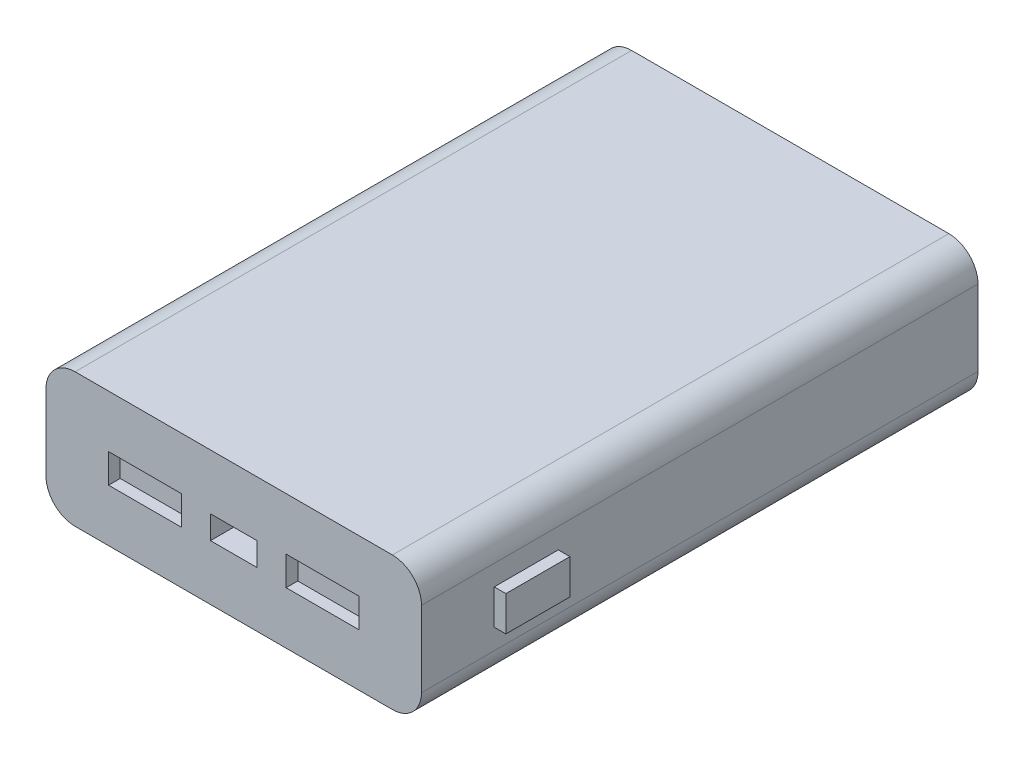
ISO-10303-21;
HEADER;
FILE_DESCRIPTION(('STEP AP214'),'2;1');
FILE_NAME('part.step','',(''),(''),'','','');
FILE_SCHEMA(('AUTOMOTIVE_DESIGN { 1 0 10303 214 1 1 1 1 }'));
ENDSEC;
DATA;
#1=APPLICATION_CONTEXT('core data for automotive mechanical design processes');
#2=APPLICATION_PROTOCOL_DEFINITION('international standard','automotive_design',2000,#1);
#3=PRODUCT_CONTEXT('',#1,'mechanical');
#4=PRODUCT('Part','Part','',(#3));
#5=PRODUCT_RELATED_PRODUCT_CATEGORY('part','',(#4));
#6=PRODUCT_DEFINITION_FORMATION('','',#4);
#7=PRODUCT_DEFINITION_CONTEXT('part definition',#1,'design');
#8=PRODUCT_DEFINITION('design','',#6,#7);
#9=PRODUCT_DEFINITION_SHAPE('','',#8);
#10=(LENGTH_UNIT() NAMED_UNIT(*) SI_UNIT(.MILLI.,.METRE.));
#11=(NAMED_UNIT(*) PLANE_ANGLE_UNIT() SI_UNIT($,.RADIAN.));
#12=(NAMED_UNIT(*) SI_UNIT($,.STERADIAN.) SOLID_ANGLE_UNIT());
#13=UNCERTAINTY_MEASURE_WITH_UNIT(LENGTH_MEASURE(1.E-05),#10,'distance_accuracy_value','');
#14=(GEOMETRIC_REPRESENTATION_CONTEXT(3) GLOBAL_UNCERTAINTY_ASSIGNED_CONTEXT((#13)) GLOBAL_UNIT_ASSIGNED_CONTEXT((#10,
#11,#12)) REPRESENTATION_CONTEXT('',''));
#15=CARTESIAN_POINT('',(0.,0.,0.));
#16=DIRECTION('',(0.,0.,1.));
#17=DIRECTION('',(1.,0.,0.));
#18=AXIS2_PLACEMENT_3D('',#15,#16,#17);
#19=CARTESIAN_POINT('',(34.25,-3.,72.1));
#20=DIRECTION('',(0.,0.,1.));
#21=DIRECTION('',(1.,0.,0.));
#22=AXIS2_PLACEMENT_3D('',#19,#20,#21);
#23=PLANE('',#22);
#24=DIRECTION('',(0.,1.,0.));
#25=VECTOR('',#24,1.);
#26=CARTESIAN_POINT('',(32.25,-3.,72.1));
#27=LINE('',#26,#25);
#28=CARTESIAN_POINT('',(32.25,-3.,72.1));
#29=VERTEX_POINT('',#28);
#30=CARTESIAN_POINT('',(32.25,3.,72.1));
#31=VERTEX_POINT('',#30);
#32=EDGE_CURVE('E105',#29,#31,#27,.T.);
#33=ORIENTED_EDGE('',*,*,#32,.T.);
#34=DIRECTION('',(-1.,0.,0.));
#35=VECTOR('',#34,1.);
#36=CARTESIAN_POINT('',(34.25,3.,72.1));
#37=LINE('',#36,#35);
#38=CARTESIAN_POINT('',(34.25,3.,72.1));
#39=VERTEX_POINT('',#38);
#40=EDGE_CURVE('E12',#39,#31,#37,.T.);
#41=ORIENTED_EDGE('',*,*,#40,.F.);
#42=DIRECTION('',(0.,1.,0.));
#43=VECTOR('',#42,1.);
#44=CARTESIAN_POINT('',(34.25,-3.,72.1));
#45=LINE('',#44,#43);
#46=CARTESIAN_POINT('',(34.25,-3.,72.1));
#47=VERTEX_POINT('',#46);
#48=EDGE_CURVE('E93',#47,#39,#45,.T.);
#49=ORIENTED_EDGE('',*,*,#48,.F.);
#50=DIRECTION('',(-1.,0.,0.));
#51=VECTOR('',#50,1.);
#52=CARTESIAN_POINT('',(34.25,-3.,72.1));
#53=LINE('',#52,#51);
#54=EDGE_CURVE('E101',#47,#29,#53,.T.);
#55=ORIENTED_EDGE('',*,*,#54,.T.);
#56=EDGE_LOOP('',(#33,#41,#49,#55));
#57=FACE_BOUND('',#56,.T.);
#58=ADVANCED_FACE('F42',(#57),#23,.F.);
#59=CARTESIAN_POINT('',(34.25,3.,83.1));
#60=DIRECTION('',(0.,-1.,0.));
#61=DIRECTION('',(0.,0.,-1.));
#62=AXIS2_PLACEMENT_3D('',#59,#60,#61);
#63=PLANE('',#62);
#64=DIRECTION('',(0.,0.,1.));
#65=VECTOR('',#64,1.);
#66=CARTESIAN_POINT('',(32.25,3.,83.1));
#67=LINE('',#66,#65);
#68=CARTESIAN_POINT('',(32.25,3.,83.1));
#69=VERTEX_POINT('',#68);
#70=EDGE_CURVE('E97',#31,#69,#67,.T.);
#71=ORIENTED_EDGE('',*,*,#70,.T.);
#72=DIRECTION('',(-1.,0.,0.));
#73=VECTOR('',#72,1.);
#74=CARTESIAN_POINT('',(34.25,3.,83.1));
#75=LINE('',#74,#73);
#76=CARTESIAN_POINT('',(34.25,3.,83.1));
#77=VERTEX_POINT('',#76);
#78=EDGE_CURVE('E50',#77,#69,#75,.T.);
#79=ORIENTED_EDGE('',*,*,#78,.F.);
#80=DIRECTION('',(0.,0.,1.));
#81=VECTOR('',#80,1.);
#82=CARTESIAN_POINT('',(34.25,3.,83.1));
#83=LINE('',#82,#81);
#84=EDGE_CURVE('E88',#39,#77,#83,.T.);
#85=ORIENTED_EDGE('',*,*,#84,.F.);
#86=ORIENTED_EDGE('',*,*,#40,.T.);
#87=EDGE_LOOP('',(#71,#79,#85,#86));
#88=FACE_BOUND('',#87,.T.);
#89=ADVANCED_FACE('F96',(#88),#63,.F.);
#90=CARTESIAN_POINT('',(34.25,-3.,83.1));
#91=DIRECTION('',(0.,0.,-1.));
#92=DIRECTION('',(-1.,0.,0.));
#93=AXIS2_PLACEMENT_3D('',#90,#91,#92);
#94=PLANE('',#93);
#95=DIRECTION('',(0.,-1.,0.));
#96=VECTOR('',#95,1.);
#97=CARTESIAN_POINT('',(32.25,-3.,83.1));
#98=LINE('',#97,#96);
#99=CARTESIAN_POINT('',(32.25,-3.,83.1));
#100=VERTEX_POINT('',#99);
#101=EDGE_CURVE('E75',#69,#100,#98,.T.);
#102=ORIENTED_EDGE('',*,*,#101,.T.);
#103=DIRECTION('',(-1.,0.,0.));
#104=VECTOR('',#103,1.);
#105=CARTESIAN_POINT('',(34.25,-3.,83.1));
#106=LINE('',#105,#104);
#107=CARTESIAN_POINT('',(34.25,-3.,83.1));
#108=VERTEX_POINT('',#107);
#109=EDGE_CURVE('E98',#108,#100,#106,.T.);
#110=ORIENTED_EDGE('',*,*,#109,.F.);
#111=DIRECTION('',(0.,-1.,0.));
#112=VECTOR('',#111,1.);
#113=CARTESIAN_POINT('',(34.25,-3.,83.1));
#114=LINE('',#113,#112);
#115=EDGE_CURVE('E91',#77,#108,#114,.T.);
#116=ORIENTED_EDGE('',*,*,#115,.F.);
#117=ORIENTED_EDGE('',*,*,#78,.T.);
#118=EDGE_LOOP('',(#102,#110,#116,#117));
#119=FACE_BOUND('',#118,.T.);
#120=ADVANCED_FACE('F99',(#119),#94,.F.);
#121=CARTESIAN_POINT('',(34.25,-3.,83.1));
#122=DIRECTION('',(0.,1.,0.));
#123=DIRECTION('',(0.,0.,1.));
#124=AXIS2_PLACEMENT_3D('',#121,#122,#123);
#125=PLANE('',#124);
#126=DIRECTION('',(0.,0.,-1.));
#127=VECTOR('',#126,1.);
#128=CARTESIAN_POINT('',(32.25,-3.,83.1));
#129=LINE('',#128,#127);
#130=EDGE_CURVE('E81',#100,#29,#129,.T.);
#131=ORIENTED_EDGE('',*,*,#130,.T.);
#132=ORIENTED_EDGE('',*,*,#54,.F.);
#133=DIRECTION('',(0.,0.,-1.));
#134=VECTOR('',#133,1.);
#135=CARTESIAN_POINT('',(34.25,-3.,83.1));
#136=LINE('',#135,#134);
#137=EDGE_CURVE('E58',#108,#47,#136,.T.);
#138=ORIENTED_EDGE('',*,*,#137,.F.);
#139=ORIENTED_EDGE('',*,*,#109,.T.);
#140=EDGE_LOOP('',(#131,#132,#138,#139));
#141=FACE_BOUND('',#140,.T.);
#142=ADVANCED_FACE('F112',(#141),#125,.F.);
#143=CARTESIAN_POINT('',(34.25,0.,0.));
#144=DIRECTION('',(-1.,0.,0.));
#145=DIRECTION('',(0.,0.,1.));
#146=AXIS2_PLACEMENT_3D('',#143,#144,#145);
#147=PLANE('',#146);
#148=ORIENTED_EDGE('',*,*,#48,.T.);
#149=ORIENTED_EDGE('',*,*,#84,.T.);
#150=ORIENTED_EDGE('',*,*,#115,.T.);
#151=ORIENTED_EDGE('',*,*,#137,.T.);
#152=EDGE_LOOP('',(#148,#149,#150,#151));
#153=FACE_BOUND('',#152,.T.);
#154=ADVANCED_FACE('F89',(#153),#147,.F.);
#155=CARTESIAN_POINT('',(32.25,0.,0.));
#156=DIRECTION('',(-1.,0.,0.));
#157=DIRECTION('',(0.,0.,1.));
#158=AXIS2_PLACEMENT_3D('',#155,#156,#157);
#159=PLANE('',#158);
#160=ORIENTED_EDGE('',*,*,#32,.F.);
#161=ORIENTED_EDGE('',*,*,#130,.F.);
#162=ORIENTED_EDGE('',*,*,#101,.F.);
#163=ORIENTED_EDGE('',*,*,#70,.F.);
#164=EDGE_LOOP('',(#160,#161,#162,#163));
#165=FACE_BOUND('',#164,.T.);
#166=ADVANCED_FACE('F115',(#165),#159,.T.);
#167=CLOSED_SHELL('',(#58,#89,#120,#142,#154,#166));
#168=MANIFOLD_SOLID_BREP('B2',#167);
#169=CARTESIAN_POINT('',(32.25,-11.5,95.6));
#170=DIRECTION('',(-1.,0.,0.));
#171=DIRECTION('',(0.,0.,1.));
#172=AXIS2_PLACEMENT_3D('',#169,#170,#171);
#173=PLANE('',#172);
#174=DIRECTION('',(0.,1.,0.));
#175=VECTOR('',#174,1.);
#176=CARTESIAN_POINT('',(32.25,-11.5,95.6));
#177=LINE('',#176,#175);
#178=CARTESIAN_POINT('',(32.25,-6.5,95.6));
#179=VERTEX_POINT('',#178);
#180=CARTESIAN_POINT('',(32.25,6.50000000000001,95.6));
#181=VERTEX_POINT('',#180);
#182=EDGE_CURVE('E459',#179,#181,#177,.T.);
#183=ORIENTED_EDGE('',*,*,#182,.F.);
#184=DIRECTION('',(0.,0.,-1.));
#185=VECTOR('',#184,1.);
#186=CARTESIAN_POINT('',(32.25,-6.5,95.6));
#187=LINE('',#186,#185);
#188=CARTESIAN_POINT('',(32.25,-6.5,0.));
#189=VERTEX_POINT('',#188);
#190=EDGE_CURVE('E40',#179,#189,#187,.T.);
#191=ORIENTED_EDGE('',*,*,#190,.T.);
#192=DIRECTION('',(0.,1.,0.));
#193=VECTOR('',#192,1.);
#194=CARTESIAN_POINT('',(32.25,-11.5,0.));
#195=LINE('',#194,#193);
#196=CARTESIAN_POINT('',(32.25,6.50000000000001,0.));
#197=VERTEX_POINT('',#196);
#198=EDGE_CURVE('E452',#189,#197,#195,.T.);
#199=ORIENTED_EDGE('',*,*,#198,.T.);
#200=DIRECTION('',(0.,0.,-1.));
#201=VECTOR('',#200,1.);
#202=CARTESIAN_POINT('',(32.25,6.50000000000001,95.6));
#203=LINE('',#202,#201);
#204=EDGE_CURVE('E173',#197,#181,#203,.F.);
#205=ORIENTED_EDGE('',*,*,#204,.T.);
#206=EDGE_LOOP('',(#183,#191,#199,#205));
#207=FACE_BOUND('',#206,.T.);
#208=ADVANCED_FACE('F165',(#207),#173,.F.);
#209=CARTESIAN_POINT('',(-32.25,11.5,95.6));
#210=DIRECTION('',(0.,-1.,0.));
#211=DIRECTION('',(0.,0.,-1.));
#212=AXIS2_PLACEMENT_3D('',#209,#210,#211);
#213=PLANE('',#212);
#214=DIRECTION('',(-1.,0.,0.));
#215=VECTOR('',#214,1.);
#216=CARTESIAN_POINT('',(-32.25,11.5,0.));
#217=LINE('',#216,#215);
#218=CARTESIAN_POINT('',(27.25,11.5,0.));
#219=VERTEX_POINT('',#218);
#220=CARTESIAN_POINT('',(-27.25,11.5,0.));
#221=VERTEX_POINT('',#220);
#222=EDGE_CURVE('E475',#219,#221,#217,.T.);
#223=ORIENTED_EDGE('',*,*,#222,.T.);
#224=DIRECTION('',(0.,0.,-1.));
#225=VECTOR('',#224,1.);
#226=CARTESIAN_POINT('',(-27.25,11.5,95.6));
#227=LINE('',#226,#225);
#228=CARTESIAN_POINT('',(-27.25,11.5,95.6));
#229=VERTEX_POINT('',#228);
#230=EDGE_CURVE('E511',#221,#229,#227,.F.);
#231=ORIENTED_EDGE('',*,*,#230,.T.);
#232=DIRECTION('',(-1.,0.,0.));
#233=VECTOR('',#232,1.);
#234=CARTESIAN_POINT('',(-32.25,11.5,95.6));
#235=LINE('',#234,#233);
#236=CARTESIAN_POINT('',(27.25,11.5,95.6));
#237=VERTEX_POINT('',#236);
#238=EDGE_CURVE('E462',#237,#229,#235,.T.);
#239=ORIENTED_EDGE('',*,*,#238,.F.);
#240=DIRECTION('',(0.,0.,-1.));
#241=VECTOR('',#240,1.);
#242=CARTESIAN_POINT('',(27.25,11.5,95.6));
#243=LINE('',#242,#241);
#244=EDGE_CURVE('E508',#237,#219,#243,.T.);
#245=ORIENTED_EDGE('',*,*,#244,.T.);
#246=EDGE_LOOP('',(#223,#231,#239,#245));
#247=FACE_BOUND('',#246,.T.);
#248=ADVANCED_FACE('F526',(#247),#213,.F.);
#249=CARTESIAN_POINT('',(-32.25,-11.5,95.6));
#250=DIRECTION('',(1.,0.,0.));
#251=DIRECTION('',(0.,0.,-1.));
#252=AXIS2_PLACEMENT_3D('',#249,#250,#251);
#253=PLANE('',#252);
#254=DIRECTION('',(0.,-1.,0.));
#255=VECTOR('',#254,1.);
#256=CARTESIAN_POINT('',(-32.25,-11.5,0.));
#257=LINE('',#256,#255);
#258=CARTESIAN_POINT('',(-32.25,6.5,0.));
#259=VERTEX_POINT('',#258);
#260=CARTESIAN_POINT('',(-32.25,-6.5,0.));
#261=VERTEX_POINT('',#260);
#262=EDGE_CURVE('E478',#259,#261,#257,.T.);
#263=ORIENTED_EDGE('',*,*,#262,.T.);
#264=DIRECTION('',(0.,0.,-1.));
#265=VECTOR('',#264,1.);
#266=CARTESIAN_POINT('',(-32.25,-6.5,95.6));
#267=LINE('',#266,#265);
#268=CARTESIAN_POINT('',(-32.25,-6.5,95.6));
#269=VERTEX_POINT('',#268);
#270=EDGE_CURVE('E498',#261,#269,#267,.F.);
#271=ORIENTED_EDGE('',*,*,#270,.T.);
#272=DIRECTION('',(0.,-1.,0.));
#273=VECTOR('',#272,1.);
#274=CARTESIAN_POINT('',(-32.25,-11.5,95.6));
#275=LINE('',#274,#273);
#276=CARTESIAN_POINT('',(-32.25,6.5,95.6));
#277=VERTEX_POINT('',#276);
#278=EDGE_CURVE('E466',#277,#269,#275,.T.);
#279=ORIENTED_EDGE('',*,*,#278,.F.);
#280=DIRECTION('',(0.,0.,-1.));
#281=VECTOR('',#280,1.);
#282=CARTESIAN_POINT('',(-32.25,6.5,95.6));
#283=LINE('',#282,#281);
#284=EDGE_CURVE('E495',#277,#259,#283,.T.);
#285=ORIENTED_EDGE('',*,*,#284,.T.);
#286=EDGE_LOOP('',(#263,#271,#279,#285));
#287=FACE_BOUND('',#286,.T.);
#288=ADVANCED_FACE('F538',(#287),#253,.F.);
#289=CARTESIAN_POINT('',(-32.25,-11.5,95.6));
#290=DIRECTION('',(0.,1.,0.));
#291=DIRECTION('',(0.,0.,1.));
#292=AXIS2_PLACEMENT_3D('',#289,#290,#291);
#293=PLANE('',#292);
#294=DIRECTION('',(-1.,0.,0.));
#295=VECTOR('',#294,1.);
#296=CARTESIAN_POINT('',(7.75000000000002,-11.5,86.1));
#297=LINE('',#296,#295);
#298=CARTESIAN_POINT('',(24.75,-11.5,86.1));
#299=VERTEX_POINT('',#298);
#300=CARTESIAN_POINT('',(7.75000000000002,-11.5,86.1));
#301=VERTEX_POINT('',#300);
#302=EDGE_CURVE('E355',#299,#301,#297,.T.);
#303=ORIENTED_EDGE('',*,*,#302,.F.);
#304=DIRECTION('',(0.,0.,1.));
#305=VECTOR('',#304,1.);
#306=CARTESIAN_POINT('',(24.75,-11.5,73.1));
#307=LINE('',#306,#305);
#308=CARTESIAN_POINT('',(24.75,-11.5,73.1));
#309=VERTEX_POINT('',#308);
#310=EDGE_CURVE('E180',#309,#299,#307,.T.);
#311=ORIENTED_EDGE('',*,*,#310,.F.);
#312=DIRECTION('',(1.,0.,0.));
#313=VECTOR('',#312,1.);
#314=CARTESIAN_POINT('',(7.75000000000002,-11.5,73.1));
#315=LINE('',#314,#313);
#316=CARTESIAN_POINT('',(7.75000000000002,-11.5,73.1));
#317=VERTEX_POINT('',#316);
#318=EDGE_CURVE('E346',#317,#309,#315,.T.);
#319=ORIENTED_EDGE('',*,*,#318,.F.);
#320=DIRECTION('',(0.,0.,-1.));
#321=VECTOR('',#320,1.);
#322=CARTESIAN_POINT('',(7.75000000000002,-11.5,73.1));
#323=LINE('',#322,#321);
#324=EDGE_CURVE('E349',#301,#317,#323,.T.);
#325=ORIENTED_EDGE('',*,*,#324,.F.);
#326=EDGE_LOOP('',(#303,#311,#319,#325));
#327=FACE_BOUND('',#326,.T.);
#328=DIRECTION('',(1.,0.,0.));
#329=VECTOR('',#328,1.);
#330=CARTESIAN_POINT('',(-32.25,-11.5,95.6));
#331=LINE('',#330,#329);
#332=CARTESIAN_POINT('',(-27.25,-11.5,95.6));
#333=VERTEX_POINT('',#332);
#334=CARTESIAN_POINT('',(27.25,-11.5,95.6));
#335=VERTEX_POINT('',#334);
#336=EDGE_CURVE('E469',#333,#335,#331,.T.);
#337=ORIENTED_EDGE('',*,*,#336,.F.);
#338=DIRECTION('',(0.,0.,-1.));
#339=VECTOR('',#338,1.);
#340=CARTESIAN_POINT('',(-27.25,-11.5,95.6));
#341=LINE('',#340,#339);
#342=CARTESIAN_POINT('',(-27.25,-11.5,0.));
#343=VERTEX_POINT('',#342);
#344=EDGE_CURVE('E484',#333,#343,#341,.T.);
#345=ORIENTED_EDGE('',*,*,#344,.T.);
#346=DIRECTION('',(1.,0.,0.));
#347=VECTOR('',#346,1.);
#348=CARTESIAN_POINT('',(-32.25,-11.5,0.));
#349=LINE('',#348,#347);
#350=CARTESIAN_POINT('',(27.25,-11.5,0.));
#351=VERTEX_POINT('',#350);
#352=EDGE_CURVE('E463',#343,#351,#349,.T.);
#353=ORIENTED_EDGE('',*,*,#352,.T.);
#354=DIRECTION('',(0.,0.,-1.));
#355=VECTOR('',#354,1.);
#356=CARTESIAN_POINT('',(27.25,-11.5,95.6));
#357=LINE('',#356,#355);
#358=EDGE_CURVE('E472',#351,#335,#357,.F.);
#359=ORIENTED_EDGE('',*,*,#358,.T.);
#360=EDGE_LOOP('',(#337,#345,#353,#359));
#361=FACE_BOUND('',#360,.T.);
#362=ADVANCED_FACE('F546',(#327,#361),#293,.F.);
#363=CARTESIAN_POINT('',(0.,0.,95.6));
#364=DIRECTION('',(0.,0.,-1.));
#365=DIRECTION('',(-1.,0.,0.));
#366=AXIS2_PLACEMENT_3D('',#363,#364,#365);
#367=PLANE('',#366);
#368=DIRECTION('',(-1.,0.,0.));
#369=VECTOR('',#368,1.);
#370=CARTESIAN_POINT('',(-21.5,2.5,95.6));
#371=LINE('',#370,#369);
#372=CARTESIAN_POINT('',(-9.,2.5,95.6));
#373=VERTEX_POINT('',#372);
#374=CARTESIAN_POINT('',(-21.5,2.5,95.6));
#375=VERTEX_POINT('',#374);
#376=EDGE_CURVE('E380',#373,#375,#371,.T.);
#377=ORIENTED_EDGE('',*,*,#376,.F.);
#378=DIRECTION('',(0.,1.,0.));
#379=VECTOR('',#378,1.);
#380=CARTESIAN_POINT('',(-9.,-2.5,95.6));
#381=LINE('',#380,#379);
#382=CARTESIAN_POINT('',(-9.,-2.5,95.6));
#383=VERTEX_POINT('',#382);
#384=EDGE_CURVE('E188',#383,#373,#381,.T.);
#385=ORIENTED_EDGE('',*,*,#384,.F.);
#386=DIRECTION('',(1.,0.,0.));
#387=VECTOR('',#386,1.);
#388=CARTESIAN_POINT('',(-21.5,-2.5,95.6));
#389=LINE('',#388,#387);
#390=CARTESIAN_POINT('',(-21.5,-2.5,95.6));
#391=VERTEX_POINT('',#390);
#392=EDGE_CURVE('E369',#391,#383,#389,.T.);
#393=ORIENTED_EDGE('',*,*,#392,.F.);
#394=DIRECTION('',(0.,-1.,0.));
#395=VECTOR('',#394,1.);
#396=CARTESIAN_POINT('',(-21.5,-2.5,95.6));
#397=LINE('',#396,#395);
#398=EDGE_CURVE('E384',#375,#391,#397,.T.);
#399=ORIENTED_EDGE('',*,*,#398,.F.);
#400=EDGE_LOOP('',(#377,#385,#393,#399));
#401=FACE_BOUND('',#400,.T.);
#402=DIRECTION('',(-1.,0.,0.));
#403=VECTOR('',#402,1.);
#404=CARTESIAN_POINT('',(21.5,2.5,95.6));
#405=LINE('',#404,#403);
#406=CARTESIAN_POINT('',(21.5,2.5,95.6));
#407=VERTEX_POINT('',#406);
#408=CARTESIAN_POINT('',(9.,2.5,95.6));
#409=VERTEX_POINT('',#408);
#410=EDGE_CURVE('E412',#407,#409,#405,.T.);
#411=ORIENTED_EDGE('',*,*,#410,.F.);
#412=DIRECTION('',(0.,1.,0.));
#413=VECTOR('',#412,1.);
#414=CARTESIAN_POINT('',(21.5,-2.5,95.6));
#415=LINE('',#414,#413);
#416=CARTESIAN_POINT('',(21.5,-2.5,95.6));
#417=VERTEX_POINT('',#416);
#418=EDGE_CURVE('E361',#417,#407,#415,.T.);
#419=ORIENTED_EDGE('',*,*,#418,.F.);
#420=DIRECTION('',(1.,0.,0.));
#421=VECTOR('',#420,1.);
#422=CARTESIAN_POINT('',(21.5,-2.5,95.6));
#423=LINE('',#422,#421);
#424=CARTESIAN_POINT('',(9.,-2.5,95.6));
#425=VERTEX_POINT('',#424);
#426=EDGE_CURVE('E401',#425,#417,#423,.T.);
#427=ORIENTED_EDGE('',*,*,#426,.F.);
#428=DIRECTION('',(0.,-1.,0.));
#429=VECTOR('',#428,1.);
#430=CARTESIAN_POINT('',(9.,-2.5,95.6));
#431=LINE('',#430,#429);
#432=EDGE_CURVE('E415',#409,#425,#431,.T.);
#433=ORIENTED_EDGE('',*,*,#432,.F.);
#434=EDGE_LOOP('',(#411,#419,#427,#433));
#435=FACE_BOUND('',#434,.T.);
#436=DIRECTION('',(-1.,0.,0.));
#437=VECTOR('',#436,1.);
#438=CARTESIAN_POINT('',(-4.,2.,95.6));
#439=LINE('',#438,#437);
#440=CARTESIAN_POINT('',(4.,2.,95.6));
#441=VERTEX_POINT('',#440);
#442=CARTESIAN_POINT('',(-4.,2.,95.6));
#443=VERTEX_POINT('',#442);
#444=EDGE_CURVE('E442',#441,#443,#439,.T.);
#445=ORIENTED_EDGE('',*,*,#444,.F.);
#446=DIRECTION('',(0.,1.,0.));
#447=VECTOR('',#446,1.);
#448=CARTESIAN_POINT('',(4.,-2.,95.6));
#449=LINE('',#448,#447);
#450=CARTESIAN_POINT('',(4.,-2.,95.6));
#451=VERTEX_POINT('',#450);
#452=EDGE_CURVE('E391',#451,#441,#449,.T.);
#453=ORIENTED_EDGE('',*,*,#452,.F.);
#454=DIRECTION('',(1.,0.,0.));
#455=VECTOR('',#454,1.);
#456=CARTESIAN_POINT('',(-4.,-2.,95.6));
#457=LINE('',#456,#455);
#458=CARTESIAN_POINT('',(-4.,-2.,95.6));
#459=VERTEX_POINT('',#458);
#460=EDGE_CURVE('E431',#459,#451,#457,.T.);
#461=ORIENTED_EDGE('',*,*,#460,.F.);
#462=DIRECTION('',(0.,-1.,0.));
#463=VECTOR('',#462,1.);
#464=CARTESIAN_POINT('',(-4.,-2.,95.6));
#465=LINE('',#464,#463);
#466=EDGE_CURVE('E445',#443,#459,#465,.T.);
#467=ORIENTED_EDGE('',*,*,#466,.F.);
#468=EDGE_LOOP('',(#445,#453,#461,#467));
#469=FACE_BOUND('',#468,.T.);
#470=ORIENTED_EDGE('',*,*,#278,.T.);
#471=CARTESIAN_POINT('',(-27.25,-6.5,95.6));
#472=DIRECTION('',(0.,0.,-1.));
#473=DIRECTION('',(-1.,0.,0.));
#474=AXIS2_PLACEMENT_3D('',#471,#472,#473);
#475=CIRCLE('',#474,5.);
#476=EDGE_CURVE('E506',#269,#333,#475,.F.);
#477=ORIENTED_EDGE('',*,*,#476,.T.);
#478=ORIENTED_EDGE('',*,*,#336,.T.);
#479=CARTESIAN_POINT('',(27.25,-6.5,95.6));
#480=DIRECTION('',(0.,0.,-1.));
#481=DIRECTION('',(-1.,0.,0.));
#482=AXIS2_PLACEMENT_3D('',#479,#480,#481);
#483=CIRCLE('',#482,5.);
#484=EDGE_CURVE('E502',#335,#179,#483,.F.);
#485=ORIENTED_EDGE('',*,*,#484,.T.);
#486=ORIENTED_EDGE('',*,*,#182,.T.);
#487=CARTESIAN_POINT('',(27.25,6.5,95.6));
#488=DIRECTION('',(0.,0.,-1.));
#489=DIRECTION('',(-1.,0.,0.));
#490=AXIS2_PLACEMENT_3D('',#487,#488,#489);
#491=CIRCLE('',#490,5.);
#492=EDGE_CURVE('E500',#181,#237,#491,.F.);
#493=ORIENTED_EDGE('',*,*,#492,.T.);
#494=ORIENTED_EDGE('',*,*,#238,.T.);
#495=CARTESIAN_POINT('',(-27.25,6.5,95.6));
#496=DIRECTION('',(0.,0.,-1.));
#497=DIRECTION('',(-1.,0.,0.));
#498=AXIS2_PLACEMENT_3D('',#495,#496,#497);
#499=CIRCLE('',#498,5.);
#500=EDGE_CURVE('E504',#229,#277,#499,.F.);
#501=ORIENTED_EDGE('',*,*,#500,.T.);
#502=EDGE_LOOP('',(#470,#477,#478,#485,#486,#493,#494,#501));
#503=FACE_BOUND('',#502,.T.);
#504=ADVANCED_FACE('F520',(#401,#435,#469,#503),#367,.F.);
#505=CARTESIAN_POINT('',(0.,0.,0.));
#506=DIRECTION('',(0.,0.,-1.));
#507=DIRECTION('',(-1.,0.,0.));
#508=AXIS2_PLACEMENT_3D('',#505,#506,#507);
#509=PLANE('',#508);
#510=ORIENTED_EDGE('',*,*,#352,.F.);
#511=CARTESIAN_POINT('',(-27.25,-6.5,0.));
#512=DIRECTION('',(0.,0.,-1.));
#513=DIRECTION('',(-1.,0.,0.));
#514=AXIS2_PLACEMENT_3D('',#511,#512,#513);
#515=CIRCLE('',#514,5.);
#516=EDGE_CURVE('E493',#343,#261,#515,.T.);
#517=ORIENTED_EDGE('',*,*,#516,.T.);
#518=ORIENTED_EDGE('',*,*,#262,.F.);
#519=CARTESIAN_POINT('',(-27.25,6.5,0.));
#520=DIRECTION('',(0.,0.,-1.));
#521=DIRECTION('',(-1.,0.,0.));
#522=AXIS2_PLACEMENT_3D('',#519,#520,#521);
#523=CIRCLE('',#522,5.);
#524=EDGE_CURVE('E491',#259,#221,#523,.T.);
#525=ORIENTED_EDGE('',*,*,#524,.T.);
#526=ORIENTED_EDGE('',*,*,#222,.F.);
#527=CARTESIAN_POINT('',(27.25,6.5,0.));
#528=DIRECTION('',(0.,0.,-1.));
#529=DIRECTION('',(-1.,0.,0.));
#530=AXIS2_PLACEMENT_3D('',#527,#528,#529);
#531=CIRCLE('',#530,5.);
#532=EDGE_CURVE('E487',#219,#197,#531,.T.);
#533=ORIENTED_EDGE('',*,*,#532,.T.);
#534=ORIENTED_EDGE('',*,*,#198,.F.);
#535=CARTESIAN_POINT('',(27.25,-6.5,0.));
#536=DIRECTION('',(0.,0.,-1.));
#537=DIRECTION('',(-1.,0.,0.));
#538=AXIS2_PLACEMENT_3D('',#535,#536,#537);
#539=CIRCLE('',#538,5.);
#540=EDGE_CURVE('E489',#189,#351,#539,.T.);
#541=ORIENTED_EDGE('',*,*,#540,.T.);
#542=EDGE_LOOP('',(#510,#517,#518,#525,#526,#533,#534,#541));
#543=FACE_BOUND('',#542,.T.);
#544=ADVANCED_FACE('F530',(#543),#509,.T.);
#545=CARTESIAN_POINT('',(-27.25,-6.5,95.6));
#546=DIRECTION('',(0.,0.,-1.));
#547=DIRECTION('',(-1.,0.,0.));
#548=AXIS2_PLACEMENT_3D('',#545,#546,#547);
#549=CYLINDRICAL_SURFACE('',#548,5.);
#550=ORIENTED_EDGE('',*,*,#476,.F.);
#551=ORIENTED_EDGE('',*,*,#270,.F.);
#552=ORIENTED_EDGE('',*,*,#516,.F.);
#553=ORIENTED_EDGE('',*,*,#344,.F.);
#554=EDGE_LOOP('',(#550,#551,#552,#553));
#555=FACE_BOUND('',#554,.T.);
#556=ADVANCED_FACE('F544',(#555),#549,.T.);
#557=CARTESIAN_POINT('',(-27.25,6.5,95.6));
#558=DIRECTION('',(0.,0.,-1.));
#559=DIRECTION('',(-1.,0.,0.));
#560=AXIS2_PLACEMENT_3D('',#557,#558,#559);
#561=CYLINDRICAL_SURFACE('',#560,5.);
#562=ORIENTED_EDGE('',*,*,#500,.F.);
#563=ORIENTED_EDGE('',*,*,#230,.F.);
#564=ORIENTED_EDGE('',*,*,#524,.F.);
#565=ORIENTED_EDGE('',*,*,#284,.F.);
#566=EDGE_LOOP('',(#562,#563,#564,#565));
#567=FACE_BOUND('',#566,.T.);
#568=ADVANCED_FACE('F535',(#567),#561,.T.);
#569=CARTESIAN_POINT('',(27.25,-6.5,95.6));
#570=DIRECTION('',(0.,0.,-1.));
#571=DIRECTION('',(-1.,0.,0.));
#572=AXIS2_PLACEMENT_3D('',#569,#570,#571);
#573=CYLINDRICAL_SURFACE('',#572,5.);
#574=ORIENTED_EDGE('',*,*,#484,.F.);
#575=ORIENTED_EDGE('',*,*,#358,.F.);
#576=ORIENTED_EDGE('',*,*,#540,.F.);
#577=ORIENTED_EDGE('',*,*,#190,.F.);
#578=EDGE_LOOP('',(#574,#575,#576,#577));
#579=FACE_BOUND('',#578,.T.);
#580=ADVANCED_FACE('F549',(#579),#573,.T.);
#581=CARTESIAN_POINT('',(27.25,6.5,95.6));
#582=DIRECTION('',(0.,0.,-1.));
#583=DIRECTION('',(-1.,0.,0.));
#584=AXIS2_PLACEMENT_3D('',#581,#582,#583);
#585=CYLINDRICAL_SURFACE('',#584,5.);
#586=ORIENTED_EDGE('',*,*,#492,.F.);
#587=ORIENTED_EDGE('',*,*,#204,.F.);
#588=ORIENTED_EDGE('',*,*,#532,.F.);
#589=ORIENTED_EDGE('',*,*,#244,.F.);
#590=EDGE_LOOP('',(#586,#587,#588,#589));
#591=FACE_BOUND('',#590,.T.);
#592=ADVANCED_FACE('F167',(#591),#585,.T.);
#593=CARTESIAN_POINT('',(4.,-2.,90.6));
#594=DIRECTION('',(1.,0.,0.));
#595=DIRECTION('',(0.,0.,-1.));
#596=AXIS2_PLACEMENT_3D('',#593,#594,#595);
#597=PLANE('',#596);
#598=ORIENTED_EDGE('',*,*,#452,.T.);
#599=DIRECTION('',(0.,0.,1.));
#600=VECTOR('',#599,1.);
#601=CARTESIAN_POINT('',(4.,2.,90.6));
#602=LINE('',#601,#600);
#603=CARTESIAN_POINT('',(4.,2.,90.6));
#604=VERTEX_POINT('',#603);
#605=EDGE_CURVE('E440',#604,#441,#602,.T.);
#606=ORIENTED_EDGE('',*,*,#605,.F.);
#607=DIRECTION('',(0.,1.,0.));
#608=VECTOR('',#607,1.);
#609=CARTESIAN_POINT('',(4.,-2.,90.6));
#610=LINE('',#609,#608);
#611=CARTESIAN_POINT('',(4.,-2.,90.6));
#612=VERTEX_POINT('',#611);
#613=EDGE_CURVE('E427',#612,#604,#610,.T.);
#614=ORIENTED_EDGE('',*,*,#613,.F.);
#615=DIRECTION('',(0.,0.,1.));
#616=VECTOR('',#615,1.);
#617=CARTESIAN_POINT('',(4.,-2.,90.6));
#618=LINE('',#617,#616);
#619=EDGE_CURVE('E450',#612,#451,#618,.T.);
#620=ORIENTED_EDGE('',*,*,#619,.T.);
#621=EDGE_LOOP('',(#598,#606,#614,#620));
#622=FACE_BOUND('',#621,.T.);
#623=ADVANCED_FACE('F555',(#622),#597,.F.);
#624=CARTESIAN_POINT('',(-4.,-2.,90.6));
#625=DIRECTION('',(0.,-1.,0.));
#626=DIRECTION('',(0.,0.,-1.));
#627=AXIS2_PLACEMENT_3D('',#624,#625,#626);
#628=PLANE('',#627);
#629=ORIENTED_EDGE('',*,*,#460,.T.);
#630=ORIENTED_EDGE('',*,*,#619,.F.);
#631=DIRECTION('',(1.,0.,0.));
#632=VECTOR('',#631,1.);
#633=CARTESIAN_POINT('',(-4.,-2.,90.6));
#634=LINE('',#633,#632);
#635=CARTESIAN_POINT('',(-4.,-2.,90.6));
#636=VERTEX_POINT('',#635);
#637=EDGE_CURVE('E437',#636,#612,#634,.T.);
#638=ORIENTED_EDGE('',*,*,#637,.F.);
#639=DIRECTION('',(0.,0.,1.));
#640=VECTOR('',#639,1.);
#641=CARTESIAN_POINT('',(-4.,-2.,90.6));
#642=LINE('',#641,#640);
#643=EDGE_CURVE('E453',#636,#459,#642,.T.);
#644=ORIENTED_EDGE('',*,*,#643,.T.);
#645=EDGE_LOOP('',(#629,#630,#638,#644));
#646=FACE_BOUND('',#645,.T.);
#647=ADVANCED_FACE('F750',(#646),#628,.F.);
#648=CARTESIAN_POINT('',(-4.,-2.,90.6));
#649=DIRECTION('',(-1.,0.,0.));
#650=DIRECTION('',(0.,0.,1.));
#651=AXIS2_PLACEMENT_3D('',#648,#649,#650);
#652=PLANE('',#651);
#653=ORIENTED_EDGE('',*,*,#466,.T.);
#654=ORIENTED_EDGE('',*,*,#643,.F.);
#655=DIRECTION('',(0.,-1.,0.));
#656=VECTOR('',#655,1.);
#657=CARTESIAN_POINT('',(-4.,-2.,90.6));
#658=LINE('',#657,#656);
#659=CARTESIAN_POINT('',(-4.,2.,90.6));
#660=VERTEX_POINT('',#659);
#661=EDGE_CURVE('E434',#660,#636,#658,.T.);
#662=ORIENTED_EDGE('',*,*,#661,.F.);
#663=DIRECTION('',(0.,0.,1.));
#664=VECTOR('',#663,1.);
#665=CARTESIAN_POINT('',(-4.,2.,90.6));
#666=LINE('',#665,#664);
#667=EDGE_CURVE('E455',#660,#443,#666,.T.);
#668=ORIENTED_EDGE('',*,*,#667,.T.);
#669=EDGE_LOOP('',(#653,#654,#662,#668));
#670=FACE_BOUND('',#669,.T.);
#671=ADVANCED_FACE('F753',(#670),#652,.F.);
#672=CARTESIAN_POINT('',(-4.,2.,90.6));
#673=DIRECTION('',(0.,1.,0.));
#674=DIRECTION('',(0.,0.,1.));
#675=AXIS2_PLACEMENT_3D('',#672,#673,#674);
#676=PLANE('',#675);
#677=ORIENTED_EDGE('',*,*,#444,.T.);
#678=ORIENTED_EDGE('',*,*,#667,.F.);
#679=DIRECTION('',(-1.,0.,0.));
#680=VECTOR('',#679,1.);
#681=CARTESIAN_POINT('',(-4.,2.,90.6));
#682=LINE('',#681,#680);
#683=EDGE_CURVE('E430',#604,#660,#682,.T.);
#684=ORIENTED_EDGE('',*,*,#683,.F.);
#685=ORIENTED_EDGE('',*,*,#605,.T.);
#686=EDGE_LOOP('',(#677,#678,#684,#685));
#687=FACE_BOUND('',#686,.T.);
#688=ADVANCED_FACE('F748',(#687),#676,.F.);
#689=CARTESIAN_POINT('',(0.,0.,90.6));
#690=DIRECTION('',(0.,0.,-1.));
#691=DIRECTION('',(-1.,0.,0.));
#692=AXIS2_PLACEMENT_3D('',#689,#690,#691);
#693=PLANE('',#692);
#694=ORIENTED_EDGE('',*,*,#613,.T.);
#695=ORIENTED_EDGE('',*,*,#683,.T.);
#696=ORIENTED_EDGE('',*,*,#661,.T.);
#697=ORIENTED_EDGE('',*,*,#637,.T.);
#698=EDGE_LOOP('',(#694,#695,#696,#697));
#699=FACE_BOUND('',#698,.T.);
#700=ADVANCED_FACE('F601',(#699),#693,.F.);
#701=CARTESIAN_POINT('',(21.5,-2.5,93.6));
#702=DIRECTION('',(1.,0.,0.));
#703=DIRECTION('',(0.,0.,-1.));
#704=AXIS2_PLACEMENT_3D('',#701,#702,#703);
#705=PLANE('',#704);
#706=ORIENTED_EDGE('',*,*,#418,.T.);
#707=DIRECTION('',(0.,0.,1.));
#708=VECTOR('',#707,1.);
#709=CARTESIAN_POINT('',(21.5,2.5,93.6));
#710=LINE('',#709,#708);
#711=CARTESIAN_POINT('',(21.5,2.5,93.6));
#712=VERTEX_POINT('',#711);
#713=EDGE_CURVE('E410',#712,#407,#710,.T.);
#714=ORIENTED_EDGE('',*,*,#713,.F.);
#715=DIRECTION('',(0.,1.,0.));
#716=VECTOR('',#715,1.);
#717=CARTESIAN_POINT('',(21.5,-2.5,93.6));
#718=LINE('',#717,#716);
#719=CARTESIAN_POINT('',(21.5,-2.5,93.6));
#720=VERTEX_POINT('',#719);
#721=EDGE_CURVE('E397',#720,#712,#718,.T.);
#722=ORIENTED_EDGE('',*,*,#721,.F.);
#723=DIRECTION('',(0.,0.,1.));
#724=VECTOR('',#723,1.);
#725=CARTESIAN_POINT('',(21.5,-2.5,93.6));
#726=LINE('',#725,#724);
#727=EDGE_CURVE('E381',#720,#417,#726,.T.);
#728=ORIENTED_EDGE('',*,*,#727,.T.);
#729=EDGE_LOOP('',(#706,#714,#722,#728));
#730=FACE_BOUND('',#729,.T.);
#731=ADVANCED_FACE('F606',(#730),#705,.F.);
#732=CARTESIAN_POINT('',(21.5,-2.5,93.6));
#733=DIRECTION('',(0.,-1.,0.));
#734=DIRECTION('',(0.,0.,-1.));
#735=AXIS2_PLACEMENT_3D('',#732,#733,#734);
#736=PLANE('',#735);
#737=ORIENTED_EDGE('',*,*,#426,.T.);
#738=ORIENTED_EDGE('',*,*,#727,.F.);
#739=DIRECTION('',(1.,0.,0.));
#740=VECTOR('',#739,1.);
#741=CARTESIAN_POINT('',(21.5,-2.5,93.6));
#742=LINE('',#741,#740);
#743=CARTESIAN_POINT('',(9.,-2.5,93.6));
#744=VERTEX_POINT('',#743);
#745=EDGE_CURVE('E407',#744,#720,#742,.T.);
#746=ORIENTED_EDGE('',*,*,#745,.F.);
#747=DIRECTION('',(0.,0.,1.));
#748=VECTOR('',#747,1.);
#749=CARTESIAN_POINT('',(9.,-2.5,93.6));
#750=LINE('',#749,#748);
#751=EDGE_CURVE('E421',#744,#425,#750,.T.);
#752=ORIENTED_EDGE('',*,*,#751,.T.);
#753=EDGE_LOOP('',(#737,#738,#746,#752));
#754=FACE_BOUND('',#753,.T.);
#755=ADVANCED_FACE('F611',(#754),#736,.F.);
#756=CARTESIAN_POINT('',(9.,-2.5,93.6));
#757=DIRECTION('',(-1.,0.,0.));
#758=DIRECTION('',(0.,0.,1.));
#759=AXIS2_PLACEMENT_3D('',#756,#757,#758);
#760=PLANE('',#759);
#761=ORIENTED_EDGE('',*,*,#432,.T.);
#762=ORIENTED_EDGE('',*,*,#751,.F.);
#763=DIRECTION('',(0.,-1.,0.));
#764=VECTOR('',#763,1.);
#765=CARTESIAN_POINT('',(9.,-2.5,93.6));
#766=LINE('',#765,#764);
#767=CARTESIAN_POINT('',(9.,2.5,93.6));
#768=VERTEX_POINT('',#767);
#769=EDGE_CURVE('E404',#768,#744,#766,.T.);
#770=ORIENTED_EDGE('',*,*,#769,.F.);
#771=DIRECTION('',(0.,0.,1.));
#772=VECTOR('',#771,1.);
#773=CARTESIAN_POINT('',(9.,2.5,93.6));
#774=LINE('',#773,#772);
#775=EDGE_CURVE('E423',#768,#409,#774,.T.);
#776=ORIENTED_EDGE('',*,*,#775,.T.);
#777=EDGE_LOOP('',(#761,#762,#770,#776));
#778=FACE_BOUND('',#777,.T.);
#779=ADVANCED_FACE('F621',(#778),#760,.F.);
#780=CARTESIAN_POINT('',(21.5,2.5,93.6));
#781=DIRECTION('',(0.,1.,0.));
#782=DIRECTION('',(0.,0.,1.));
#783=AXIS2_PLACEMENT_3D('',#780,#781,#782);
#784=PLANE('',#783);
#785=ORIENTED_EDGE('',*,*,#410,.T.);
#786=ORIENTED_EDGE('',*,*,#775,.F.);
#787=DIRECTION('',(-1.,0.,0.));
#788=VECTOR('',#787,1.);
#789=CARTESIAN_POINT('',(21.5,2.5,93.6));
#790=LINE('',#789,#788);
#791=EDGE_CURVE('E400',#712,#768,#790,.T.);
#792=ORIENTED_EDGE('',*,*,#791,.F.);
#793=ORIENTED_EDGE('',*,*,#713,.T.);
#794=EDGE_LOOP('',(#785,#786,#792,#793));
#795=FACE_BOUND('',#794,.T.);
#796=ADVANCED_FACE('F631',(#795),#784,.F.);
#797=CARTESIAN_POINT('',(0.,0.,93.6));
#798=DIRECTION('',(0.,0.,1.));
#799=DIRECTION('',(1.,0.,0.));
#800=AXIS2_PLACEMENT_3D('',#797,#798,#799);
#801=PLANE('',#800);
#802=ORIENTED_EDGE('',*,*,#721,.T.);
#803=ORIENTED_EDGE('',*,*,#791,.T.);
#804=ORIENTED_EDGE('',*,*,#769,.T.);
#805=ORIENTED_EDGE('',*,*,#745,.T.);
#806=EDGE_LOOP('',(#802,#803,#804,#805));
#807=FACE_BOUND('',#806,.T.);
#808=ADVANCED_FACE('F641',(#807),#801,.T.);
#809=CARTESIAN_POINT('',(-9.,-2.5,93.6));
#810=DIRECTION('',(1.,0.,0.));
#811=DIRECTION('',(0.,0.,-1.));
#812=AXIS2_PLACEMENT_3D('',#809,#810,#811);
#813=PLANE('',#812);
#814=ORIENTED_EDGE('',*,*,#384,.T.);
#815=DIRECTION('',(0.,0.,1.));
#816=VECTOR('',#815,1.);
#817=CARTESIAN_POINT('',(-9.,2.5,93.6));
#818=LINE('',#817,#816);
#819=CARTESIAN_POINT('',(-9.,2.5,93.6));
#820=VERTEX_POINT('',#819);
#821=EDGE_CURVE('E378',#820,#373,#818,.T.);
#822=ORIENTED_EDGE('',*,*,#821,.F.);
#823=DIRECTION('',(0.,1.,0.));
#824=VECTOR('',#823,1.);
#825=CARTESIAN_POINT('',(-9.,-2.5,93.6));
#826=LINE('',#825,#824);
#827=CARTESIAN_POINT('',(-9.,-2.5,93.6));
#828=VERTEX_POINT('',#827);
#829=EDGE_CURVE('E365',#828,#820,#826,.T.);
#830=ORIENTED_EDGE('',*,*,#829,.F.);
#831=DIRECTION('',(0.,0.,1.));
#832=VECTOR('',#831,1.);
#833=CARTESIAN_POINT('',(-9.,-2.5,93.6));
#834=LINE('',#833,#832);
#835=EDGE_CURVE('E389',#828,#383,#834,.T.);
#836=ORIENTED_EDGE('',*,*,#835,.T.);
#837=EDGE_LOOP('',(#814,#822,#830,#836));
#838=FACE_BOUND('',#837,.T.);
#839=ADVANCED_FACE('F651',(#838),#813,.F.);
#840=CARTESIAN_POINT('',(-21.5,-2.5,93.6));
#841=DIRECTION('',(0.,-1.,0.));
#842=DIRECTION('',(0.,0.,-1.));
#843=AXIS2_PLACEMENT_3D('',#840,#841,#842);
#844=PLANE('',#843);
#845=ORIENTED_EDGE('',*,*,#392,.T.);
#846=ORIENTED_EDGE('',*,*,#835,.F.);
#847=DIRECTION('',(1.,0.,0.));
#848=VECTOR('',#847,1.);
#849=CARTESIAN_POINT('',(-21.5,-2.5,93.6));
#850=LINE('',#849,#848);
#851=CARTESIAN_POINT('',(-21.5,-2.5,93.6));
#852=VERTEX_POINT('',#851);
#853=EDGE_CURVE('E375',#852,#828,#850,.T.);
#854=ORIENTED_EDGE('',*,*,#853,.F.);
#855=DIRECTION('',(0.,0.,1.));
#856=VECTOR('',#855,1.);
#857=CARTESIAN_POINT('',(-21.5,-2.5,93.6));
#858=LINE('',#857,#856);
#859=EDGE_CURVE('E392',#852,#391,#858,.T.);
#860=ORIENTED_EDGE('',*,*,#859,.T.);
#861=EDGE_LOOP('',(#845,#846,#854,#860));
#862=FACE_BOUND('',#861,.T.);
#863=ADVANCED_FACE('F661',(#862),#844,.F.);
#864=CARTESIAN_POINT('',(-21.5,-2.5,93.6));
#865=DIRECTION('',(-1.,0.,0.));
#866=DIRECTION('',(0.,0.,1.));
#867=AXIS2_PLACEMENT_3D('',#864,#865,#866);
#868=PLANE('',#867);
#869=ORIENTED_EDGE('',*,*,#398,.T.);
#870=ORIENTED_EDGE('',*,*,#859,.F.);
#871=DIRECTION('',(0.,-1.,0.));
#872=VECTOR('',#871,1.);
#873=CARTESIAN_POINT('',(-21.5,-2.5,93.6));
#874=LINE('',#873,#872);
#875=CARTESIAN_POINT('',(-21.5,2.5,93.6));
#876=VERTEX_POINT('',#875);
#877=EDGE_CURVE('E372',#876,#852,#874,.T.);
#878=ORIENTED_EDGE('',*,*,#877,.F.);
#879=DIRECTION('',(0.,0.,1.));
#880=VECTOR('',#879,1.);
#881=CARTESIAN_POINT('',(-21.5,2.5,93.6));
#882=LINE('',#881,#880);
#883=EDGE_CURVE('E394',#876,#375,#882,.T.);
#884=ORIENTED_EDGE('',*,*,#883,.T.);
#885=EDGE_LOOP('',(#869,#870,#878,#884));
#886=FACE_BOUND('',#885,.T.);
#887=ADVANCED_FACE('F670',(#886),#868,.F.);
#888=CARTESIAN_POINT('',(-21.5,2.5,93.6));
#889=DIRECTION('',(0.,1.,0.));
#890=DIRECTION('',(0.,0.,1.));
#891=AXIS2_PLACEMENT_3D('',#888,#889,#890);
#892=PLANE('',#891);
#893=ORIENTED_EDGE('',*,*,#376,.T.);
#894=ORIENTED_EDGE('',*,*,#883,.F.);
#895=DIRECTION('',(-1.,0.,0.));
#896=VECTOR('',#895,1.);
#897=CARTESIAN_POINT('',(-21.5,2.5,93.6));
#898=LINE('',#897,#896);
#899=EDGE_CURVE('E368',#820,#876,#898,.T.);
#900=ORIENTED_EDGE('',*,*,#899,.F.);
#901=ORIENTED_EDGE('',*,*,#821,.T.);
#902=EDGE_LOOP('',(#893,#894,#900,#901));
#903=FACE_BOUND('',#902,.T.);
#904=ADVANCED_FACE('F680',(#903),#892,.F.);
#905=CARTESIAN_POINT('',(0.,0.,93.6));
#906=DIRECTION('',(0.,0.,-1.));
#907=DIRECTION('',(-1.,0.,0.));
#908=AXIS2_PLACEMENT_3D('',#905,#906,#907);
#909=PLANE('',#908);
#910=ORIENTED_EDGE('',*,*,#829,.T.);
#911=ORIENTED_EDGE('',*,*,#899,.T.);
#912=ORIENTED_EDGE('',*,*,#877,.T.);
#913=ORIENTED_EDGE('',*,*,#853,.T.);
#914=EDGE_LOOP('',(#910,#911,#912,#913));
#915=FACE_BOUND('',#914,.T.);
#916=ADVANCED_FACE('F689',(#915),#909,.F.);
#917=CARTESIAN_POINT('',(24.75,-9.5,73.1));
#918=DIRECTION('',(1.,0.,0.));
#919=DIRECTION('',(0.,0.,-1.));
#920=AXIS2_PLACEMENT_3D('',#917,#918,#919);
#921=PLANE('',#920);
#922=ORIENTED_EDGE('',*,*,#310,.T.);
#923=DIRECTION('',(0.,-1.,0.));
#924=VECTOR('',#923,1.);
#925=CARTESIAN_POINT('',(24.75,-9.5,86.1));
#926=LINE('',#925,#924);
#927=CARTESIAN_POINT('',(24.75,-9.5,86.1));
#928=VERTEX_POINT('',#927);
#929=EDGE_CURVE('E324',#928,#299,#926,.T.);
#930=ORIENTED_EDGE('',*,*,#929,.F.);
#931=DIRECTION('',(0.,0.,1.));
#932=VECTOR('',#931,1.);
#933=CARTESIAN_POINT('',(24.75,-9.5,73.1));
#934=LINE('',#933,#932);
#935=CARTESIAN_POINT('',(24.75,-9.5,73.1));
#936=VERTEX_POINT('',#935);
#937=EDGE_CURVE('E328',#936,#928,#934,.T.);
#938=ORIENTED_EDGE('',*,*,#937,.F.);
#939=DIRECTION('',(0.,-1.,0.));
#940=VECTOR('',#939,1.);
#941=CARTESIAN_POINT('',(24.75,-9.5,73.1));
#942=LINE('',#941,#940);
#943=EDGE_CURVE('E359',#936,#309,#942,.T.);
#944=ORIENTED_EDGE('',*,*,#943,.T.);
#945=EDGE_LOOP('',(#922,#930,#938,#944));
#946=FACE_BOUND('',#945,.T.);
#947=ADVANCED_FACE('F326',(#946),#921,.F.);
#948=CARTESIAN_POINT('',(7.75000000000002,-9.5,73.1));
#949=DIRECTION('',(0.,0.,-1.));
#950=DIRECTION('',(-1.,0.,0.));
#951=AXIS2_PLACEMENT_3D('',#948,#949,#950);
#952=PLANE('',#951);
#953=ORIENTED_EDGE('',*,*,#318,.T.);
#954=ORIENTED_EDGE('',*,*,#943,.F.);
#955=DIRECTION('',(1.,0.,0.));
#956=VECTOR('',#955,1.);
#957=CARTESIAN_POINT('',(7.75000000000002,-9.5,73.1));
#958=LINE('',#957,#956);
#959=CARTESIAN_POINT('',(7.75000000000002,-9.5,73.1));
#960=VERTEX_POINT('',#959);
#961=EDGE_CURVE('E334',#960,#936,#958,.T.);
#962=ORIENTED_EDGE('',*,*,#961,.F.);
#963=DIRECTION('',(0.,-1.,0.));
#964=VECTOR('',#963,1.);
#965=CARTESIAN_POINT('',(7.75000000000002,-9.5,73.1));
#966=LINE('',#965,#964);
#967=EDGE_CURVE('E362',#960,#317,#966,.T.);
#968=ORIENTED_EDGE('',*,*,#967,.T.);
#969=EDGE_LOOP('',(#953,#954,#962,#968));
#970=FACE_BOUND('',#969,.T.);
#971=ADVANCED_FACE('F707',(#970),#952,.F.);
#972=CARTESIAN_POINT('',(7.75000000000002,-9.5,73.1));
#973=DIRECTION('',(-1.,0.,0.));
#974=DIRECTION('',(0.,0.,1.));
#975=AXIS2_PLACEMENT_3D('',#972,#973,#974);
#976=PLANE('',#975);
#977=ORIENTED_EDGE('',*,*,#324,.T.);
#978=ORIENTED_EDGE('',*,*,#967,.F.);
#979=DIRECTION('',(0.,0.,-1.));
#980=VECTOR('',#979,1.);
#981=CARTESIAN_POINT('',(7.75000000000002,-9.5,73.1));
#982=LINE('',#981,#980);
#983=CARTESIAN_POINT('',(7.75000000000002,-9.5,86.1));
#984=VERTEX_POINT('',#983);
#985=EDGE_CURVE('E342',#984,#960,#982,.T.);
#986=ORIENTED_EDGE('',*,*,#985,.F.);
#987=DIRECTION('',(0.,-1.,0.));
#988=VECTOR('',#987,1.);
#989=CARTESIAN_POINT('',(7.75000000000002,-9.5,86.1));
#990=LINE('',#989,#988);
#991=EDGE_CURVE('E333',#984,#301,#990,.T.);
#992=ORIENTED_EDGE('',*,*,#991,.T.);
#993=EDGE_LOOP('',(#977,#978,#986,#992));
#994=FACE_BOUND('',#993,.T.);
#995=ADVANCED_FACE('F713',(#994),#976,.F.);
#996=CARTESIAN_POINT('',(7.75000000000002,-9.5,86.1));
#997=DIRECTION('',(0.,0.,1.));
#998=DIRECTION('',(1.,0.,0.));
#999=AXIS2_PLACEMENT_3D('',#996,#997,#998);
#1000=PLANE('',#999);
#1001=ORIENTED_EDGE('',*,*,#302,.T.);
#1002=ORIENTED_EDGE('',*,*,#991,.F.);
#1003=DIRECTION('',(-1.,0.,0.));
#1004=VECTOR('',#1003,1.);
#1005=CARTESIAN_POINT('',(7.75000000000002,-9.5,86.1));
#1006=LINE('',#1005,#1004);
#1007=EDGE_CURVE('E337',#928,#984,#1006,.T.);
#1008=ORIENTED_EDGE('',*,*,#1007,.F.);
#1009=ORIENTED_EDGE('',*,*,#929,.T.);
#1010=EDGE_LOOP('',(#1001,#1002,#1008,#1009));
#1011=FACE_BOUND('',#1010,.T.);
#1012=ADVANCED_FACE('F338',(#1011),#1000,.F.);
#1013=CARTESIAN_POINT('',(0.,-9.5,0.));
#1014=DIRECTION('',(0.,1.,0.));
#1015=DIRECTION('',(0.,0.,1.));
#1016=AXIS2_PLACEMENT_3D('',#1013,#1014,#1015);
#1017=PLANE('',#1016);
#1018=ORIENTED_EDGE('',*,*,#937,.T.);
#1019=ORIENTED_EDGE('',*,*,#1007,.T.);
#1020=ORIENTED_EDGE('',*,*,#985,.T.);
#1021=ORIENTED_EDGE('',*,*,#961,.T.);
#1022=EDGE_LOOP('',(#1018,#1019,#1020,#1021));
#1023=FACE_BOUND('',#1022,.T.);
#1024=ADVANCED_FACE('F344',(#1023),#1017,.F.);
#1025=CLOSED_SHELL('',(#208,#248,#288,#362,#504,#544,#556,#568,#580,#592,#623,#647,#671,#688,
#700,#731,#755,#779,#796,#808,#839,#863,#887,#904,#916,#947,#971,#995,#1012,#1024));
#1026=MANIFOLD_SOLID_BREP('B6',#1025);
#1027=ADVANCED_BREP_SHAPE_REPRESENTATION('',(#18,#168,#1026),#14);
#1028=SHAPE_DEFINITION_REPRESENTATION(#9,#1027);
ENDSEC;
END-ISO-10303-21;
